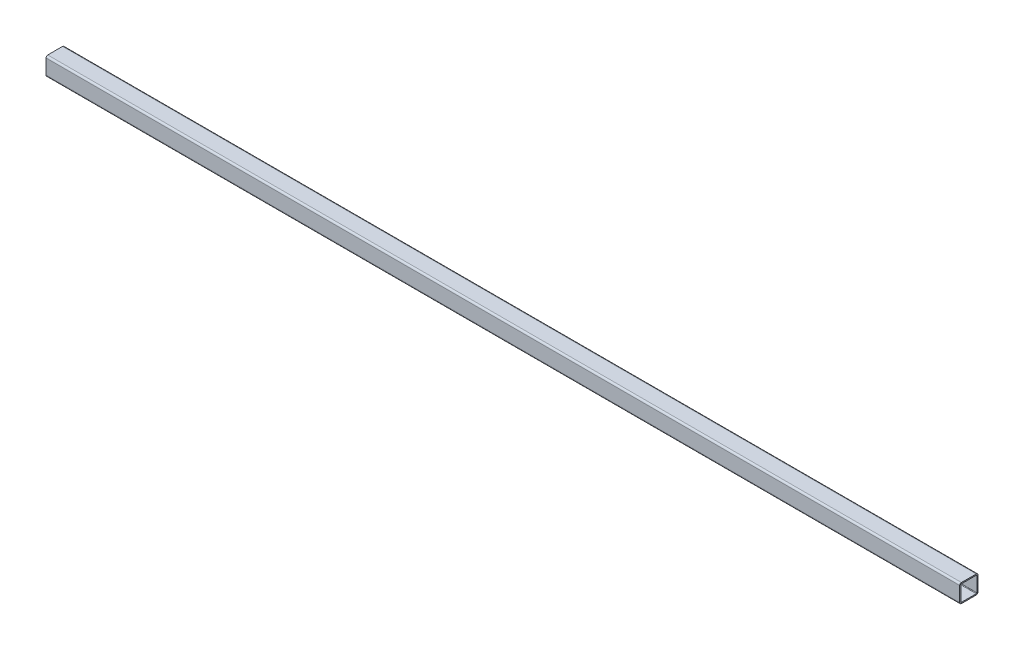
ISO-10303-21;
HEADER;
FILE_DESCRIPTION(('STEP AP214'),'2;1');
FILE_NAME('part.step','',(''),(''),'','','');
FILE_SCHEMA(('AUTOMOTIVE_DESIGN { 1 0 10303 214 1 1 1 1 }'));
ENDSEC;
DATA;
#1=APPLICATION_CONTEXT('core data for automotive mechanical design processes');
#2=APPLICATION_PROTOCOL_DEFINITION('international standard','automotive_design',2000,#1);
#3=PRODUCT_CONTEXT('',#1,'mechanical');
#4=PRODUCT('Part','Part','',(#3));
#5=PRODUCT_RELATED_PRODUCT_CATEGORY('part','',(#4));
#6=PRODUCT_DEFINITION_FORMATION('','',#4);
#7=PRODUCT_DEFINITION_CONTEXT('part definition',#1,'design');
#8=PRODUCT_DEFINITION('design','',#6,#7);
#9=PRODUCT_DEFINITION_SHAPE('','',#8);
#10=(LENGTH_UNIT() NAMED_UNIT(*) SI_UNIT(.MILLI.,.METRE.));
#11=(NAMED_UNIT(*) PLANE_ANGLE_UNIT() SI_UNIT($,.RADIAN.));
#12=(NAMED_UNIT(*) SI_UNIT($,.STERADIAN.) SOLID_ANGLE_UNIT());
#13=UNCERTAINTY_MEASURE_WITH_UNIT(LENGTH_MEASURE(1.E-05),#10,'distance_accuracy_value','');
#14=(GEOMETRIC_REPRESENTATION_CONTEXT(3) GLOBAL_UNCERTAINTY_ASSIGNED_CONTEXT((#13)) GLOBAL_UNIT_ASSIGNED_CONTEXT((#10,
#11,#12)) REPRESENTATION_CONTEXT('',''));
#15=CARTESIAN_POINT('',(0.,0.,0.));
#16=DIRECTION('',(0.,0.,1.));
#17=DIRECTION('',(1.,0.,0.));
#18=AXIS2_PLACEMENT_3D('',#15,#16,#17);
#19=CARTESIAN_POINT('',(1000.,16.25,16.25));
#20=DIRECTION('',(-1.,0.,0.));
#21=DIRECTION('',(0.,0.,1.));
#22=AXIS2_PLACEMENT_3D('',#19,#20,#21);
#23=CYLINDRICAL_SURFACE('',#22,3.75);
#24=CARTESIAN_POINT('',(-1000.,16.25,16.25));
#25=DIRECTION('',(1.,0.,0.));
#26=DIRECTION('',(0.,0.,-1.));
#27=AXIS2_PLACEMENT_3D('',#24,#25,#26);
#28=CIRCLE('',#27,3.75);
#29=CARTESIAN_POINT('',(-1000.,20.,16.25));
#30=VERTEX_POINT('',#29);
#31=CARTESIAN_POINT('',(-1000.,16.25,20.));
#32=VERTEX_POINT('',#31);
#33=EDGE_CURVE('E246',#30,#32,#28,.T.);
#34=ORIENTED_EDGE('',*,*,#33,.T.);
#35=DIRECTION('',(-1.,0.,0.));
#36=VECTOR('',#35,1.);
#37=CARTESIAN_POINT('',(1000.,16.25,20.));
#38=LINE('',#37,#36);
#39=CARTESIAN_POINT('',(1000.,16.25,20.));
#40=VERTEX_POINT('',#39);
#41=EDGE_CURVE('E14',#40,#32,#38,.T.);
#42=ORIENTED_EDGE('',*,*,#41,.F.);
#43=CARTESIAN_POINT('',(1000.,16.25,16.25));
#44=DIRECTION('',(1.,0.,0.));
#45=DIRECTION('',(0.,0.,-1.));
#46=AXIS2_PLACEMENT_3D('',#43,#44,#45);
#47=CIRCLE('',#46,3.75);
#48=CARTESIAN_POINT('',(1000.,20.,16.25));
#49=VERTEX_POINT('',#48);
#50=EDGE_CURVE('E324',#49,#40,#47,.T.);
#51=ORIENTED_EDGE('',*,*,#50,.F.);
#52=DIRECTION('',(-1.,0.,0.));
#53=VECTOR('',#52,1.);
#54=CARTESIAN_POINT('',(1000.,20.,16.25));
#55=LINE('',#54,#53);
#56=EDGE_CURVE('E261',#49,#30,#55,.T.);
#57=ORIENTED_EDGE('',*,*,#56,.T.);
#58=EDGE_LOOP('',(#34,#42,#51,#57));
#59=FACE_BOUND('',#58,.T.);
#60=ADVANCED_FACE('F74',(#59),#23,.T.);
#61=CARTESIAN_POINT('',(1000.,16.25,20.));
#62=DIRECTION('',(0.,0.,-1.));
#63=DIRECTION('',(-1.,0.,0.));
#64=AXIS2_PLACEMENT_3D('',#61,#62,#63);
#65=PLANE('',#64);
#66=DIRECTION('',(0.,-1.,0.));
#67=VECTOR('',#66,1.);
#68=CARTESIAN_POINT('',(-1000.,16.25,20.));
#69=LINE('',#68,#67);
#70=CARTESIAN_POINT('',(-1000.,-16.25,20.));
#71=VERTEX_POINT('',#70);
#72=EDGE_CURVE('E249',#32,#71,#69,.T.);
#73=ORIENTED_EDGE('',*,*,#72,.T.);
#74=DIRECTION('',(-1.,0.,0.));
#75=VECTOR('',#74,1.);
#76=CARTESIAN_POINT('',(1000.,-16.25,20.));
#77=LINE('',#76,#75);
#78=CARTESIAN_POINT('',(1000.,-16.25,20.));
#79=VERTEX_POINT('',#78);
#80=EDGE_CURVE('E84',#79,#71,#77,.T.);
#81=ORIENTED_EDGE('',*,*,#80,.F.);
#82=DIRECTION('',(0.,-1.,0.));
#83=VECTOR('',#82,1.);
#84=CARTESIAN_POINT('',(1000.,16.25,20.));
#85=LINE('',#84,#83);
#86=EDGE_CURVE('E326',#40,#79,#85,.T.);
#87=ORIENTED_EDGE('',*,*,#86,.F.);
#88=ORIENTED_EDGE('',*,*,#41,.T.);
#89=EDGE_LOOP('',(#73,#81,#87,#88));
#90=FACE_BOUND('',#89,.T.);
#91=ADVANCED_FACE('F361',(#90),#65,.F.);
#92=CARTESIAN_POINT('',(1000.,-16.25,16.25));
#93=DIRECTION('',(-1.,0.,0.));
#94=DIRECTION('',(0.,0.,1.));
#95=AXIS2_PLACEMENT_3D('',#92,#93,#94);
#96=CYLINDRICAL_SURFACE('',#95,3.75);
#97=CARTESIAN_POINT('',(-1000.,-16.25,16.25));
#98=DIRECTION('',(1.,0.,0.));
#99=DIRECTION('',(0.,0.,-1.));
#100=AXIS2_PLACEMENT_3D('',#97,#98,#99);
#101=CIRCLE('',#100,3.75);
#102=CARTESIAN_POINT('',(-1000.,-20.,16.25));
#103=VERTEX_POINT('',#102);
#104=EDGE_CURVE('E251',#71,#103,#101,.T.);
#105=ORIENTED_EDGE('',*,*,#104,.T.);
#106=DIRECTION('',(-1.,0.,0.));
#107=VECTOR('',#106,1.);
#108=CARTESIAN_POINT('',(1000.,-20.,16.25));
#109=LINE('',#108,#107);
#110=CARTESIAN_POINT('',(1000.,-20.,16.25));
#111=VERTEX_POINT('',#110);
#112=EDGE_CURVE('E268',#111,#103,#109,.T.);
#113=ORIENTED_EDGE('',*,*,#112,.F.);
#114=CARTESIAN_POINT('',(1000.,-16.25,16.25));
#115=DIRECTION('',(1.,0.,0.));
#116=DIRECTION('',(0.,0.,-1.));
#117=AXIS2_PLACEMENT_3D('',#114,#115,#116);
#118=CIRCLE('',#117,3.75);
#119=EDGE_CURVE('E328',#79,#111,#118,.T.);
#120=ORIENTED_EDGE('',*,*,#119,.F.);
#121=ORIENTED_EDGE('',*,*,#80,.T.);
#122=EDGE_LOOP('',(#105,#113,#120,#121));
#123=FACE_BOUND('',#122,.T.);
#124=ADVANCED_FACE('F366',(#123),#96,.T.);
#125=CARTESIAN_POINT('',(1000.,-20.,-16.25));
#126=DIRECTION('',(0.,1.,0.));
#127=DIRECTION('',(0.,0.,1.));
#128=AXIS2_PLACEMENT_3D('',#125,#126,#127);
#129=PLANE('',#128);
#130=DIRECTION('',(0.,0.,-1.));
#131=VECTOR('',#130,1.);
#132=CARTESIAN_POINT('',(-1000.,-20.,-16.25));
#133=LINE('',#132,#131);
#134=CARTESIAN_POINT('',(-1000.,-20.,-16.25));
#135=VERTEX_POINT('',#134);
#136=EDGE_CURVE('E253',#103,#135,#133,.T.);
#137=ORIENTED_EDGE('',*,*,#136,.T.);
#138=DIRECTION('',(-1.,0.,0.));
#139=VECTOR('',#138,1.);
#140=CARTESIAN_POINT('',(1000.,-20.,-16.25));
#141=LINE('',#140,#139);
#142=CARTESIAN_POINT('',(1000.,-20.,-16.25));
#143=VERTEX_POINT('',#142);
#144=EDGE_CURVE('E265',#143,#135,#141,.T.);
#145=ORIENTED_EDGE('',*,*,#144,.F.);
#146=DIRECTION('',(0.,0.,-1.));
#147=VECTOR('',#146,1.);
#148=CARTESIAN_POINT('',(1000.,-20.,-16.25));
#149=LINE('',#148,#147);
#150=EDGE_CURVE('E330',#111,#143,#149,.T.);
#151=ORIENTED_EDGE('',*,*,#150,.F.);
#152=ORIENTED_EDGE('',*,*,#112,.T.);
#153=EDGE_LOOP('',(#137,#145,#151,#152));
#154=FACE_BOUND('',#153,.T.);
#155=ADVANCED_FACE('F336',(#154),#129,.F.);
#156=CARTESIAN_POINT('',(1000.,-16.25,-16.25));
#157=DIRECTION('',(-1.,0.,0.));
#158=DIRECTION('',(0.,0.,1.));
#159=AXIS2_PLACEMENT_3D('',#156,#157,#158);
#160=CYLINDRICAL_SURFACE('',#159,3.75);
#161=CARTESIAN_POINT('',(-1000.,-16.25,-16.25));
#162=DIRECTION('',(1.,0.,0.));
#163=DIRECTION('',(0.,0.,-1.));
#164=AXIS2_PLACEMENT_3D('',#161,#162,#163);
#165=CIRCLE('',#164,3.75);
#166=CARTESIAN_POINT('',(-1000.,-16.25,-20.));
#167=VERTEX_POINT('',#166);
#168=EDGE_CURVE('E255',#135,#167,#165,.T.);
#169=ORIENTED_EDGE('',*,*,#168,.T.);
#170=DIRECTION('',(-1.,0.,0.));
#171=VECTOR('',#170,1.);
#172=CARTESIAN_POINT('',(1000.,-16.25,-20.));
#173=LINE('',#172,#171);
#174=CARTESIAN_POINT('',(1000.,-16.25,-20.));
#175=VERTEX_POINT('',#174);
#176=EDGE_CURVE('E213',#175,#167,#173,.T.);
#177=ORIENTED_EDGE('',*,*,#176,.F.);
#178=CARTESIAN_POINT('',(1000.,-16.25,-16.25));
#179=DIRECTION('',(1.,0.,0.));
#180=DIRECTION('',(0.,0.,-1.));
#181=AXIS2_PLACEMENT_3D('',#178,#179,#180);
#182=CIRCLE('',#181,3.75);
#183=EDGE_CURVE('E204',#143,#175,#182,.T.);
#184=ORIENTED_EDGE('',*,*,#183,.F.);
#185=ORIENTED_EDGE('',*,*,#144,.T.);
#186=EDGE_LOOP('',(#169,#177,#184,#185));
#187=FACE_BOUND('',#186,.T.);
#188=ADVANCED_FACE('F340',(#187),#160,.T.);
#189=CARTESIAN_POINT('',(1000.,-16.25,-20.));
#190=DIRECTION('',(0.,0.,1.));
#191=DIRECTION('',(1.,0.,0.));
#192=AXIS2_PLACEMENT_3D('',#189,#190,#191);
#193=PLANE('',#192);
#194=DIRECTION('',(0.,1.,0.));
#195=VECTOR('',#194,1.);
#196=CARTESIAN_POINT('',(-1000.,-16.25,-20.));
#197=LINE('',#196,#195);
#198=CARTESIAN_POINT('',(-1000.,16.25,-20.));
#199=VERTEX_POINT('',#198);
#200=EDGE_CURVE('E212',#167,#199,#197,.T.);
#201=ORIENTED_EDGE('',*,*,#200,.T.);
#202=DIRECTION('',(-1.,0.,0.));
#203=VECTOR('',#202,1.);
#204=CARTESIAN_POINT('',(1000.,16.25,-20.));
#205=LINE('',#204,#203);
#206=CARTESIAN_POINT('',(1000.,16.25,-20.));
#207=VERTEX_POINT('',#206);
#208=EDGE_CURVE('E209',#207,#199,#205,.T.);
#209=ORIENTED_EDGE('',*,*,#208,.F.);
#210=DIRECTION('',(0.,1.,0.));
#211=VECTOR('',#210,1.);
#212=CARTESIAN_POINT('',(1000.,-16.25,-20.));
#213=LINE('',#212,#211);
#214=EDGE_CURVE('E198',#175,#207,#213,.T.);
#215=ORIENTED_EDGE('',*,*,#214,.F.);
#216=ORIENTED_EDGE('',*,*,#176,.T.);
#217=EDGE_LOOP('',(#201,#209,#215,#216));
#218=FACE_BOUND('',#217,.T.);
#219=ADVANCED_FACE('F210',(#218),#193,.F.);
#220=CARTESIAN_POINT('',(1000.,16.25,-16.25));
#221=DIRECTION('',(-1.,0.,0.));
#222=DIRECTION('',(0.,0.,1.));
#223=AXIS2_PLACEMENT_3D('',#220,#221,#222);
#224=CYLINDRICAL_SURFACE('',#223,3.75);
#225=CARTESIAN_POINT('',(-1000.,16.25,-16.25));
#226=DIRECTION('',(1.,0.,0.));
#227=DIRECTION('',(0.,0.,-1.));
#228=AXIS2_PLACEMENT_3D('',#225,#226,#227);
#229=CIRCLE('',#228,3.75);
#230=CARTESIAN_POINT('',(-1000.,20.,-16.25));
#231=VERTEX_POINT('',#230);
#232=EDGE_CURVE('E146',#199,#231,#229,.T.);
#233=ORIENTED_EDGE('',*,*,#232,.T.);
#234=DIRECTION('',(-1.,0.,0.));
#235=VECTOR('',#234,1.);
#236=CARTESIAN_POINT('',(1000.,20.,-16.25));
#237=LINE('',#236,#235);
#238=CARTESIAN_POINT('',(1000.,20.,-16.25));
#239=VERTEX_POINT('',#238);
#240=EDGE_CURVE('E214',#239,#231,#237,.T.);
#241=ORIENTED_EDGE('',*,*,#240,.F.);
#242=CARTESIAN_POINT('',(1000.,16.25,-16.25));
#243=DIRECTION('',(1.,0.,0.));
#244=DIRECTION('',(0.,0.,-1.));
#245=AXIS2_PLACEMENT_3D('',#242,#243,#244);
#246=CIRCLE('',#245,3.75);
#247=EDGE_CURVE('E202',#207,#239,#246,.T.);
#248=ORIENTED_EDGE('',*,*,#247,.F.);
#249=ORIENTED_EDGE('',*,*,#208,.T.);
#250=EDGE_LOOP('',(#233,#241,#248,#249));
#251=FACE_BOUND('',#250,.T.);
#252=ADVANCED_FACE('F216',(#251),#224,.T.);
#253=CARTESIAN_POINT('',(1000.,-16.25,16.25));
#254=DIRECTION('',(-1.,0.,0.));
#255=DIRECTION('',(0.,0.,1.));
#256=AXIS2_PLACEMENT_3D('',#253,#254,#255);
#257=CYLINDRICAL_SURFACE('',#256,1.25);
#258=CARTESIAN_POINT('',(-1000.,-16.25,16.25));
#259=DIRECTION('',(1.,0.,0.));
#260=DIRECTION('',(0.,0.,-1.));
#261=AXIS2_PLACEMENT_3D('',#258,#259,#260);
#262=CIRCLE('',#261,1.25);
#263=CARTESIAN_POINT('',(-1000.,-16.25,17.5));
#264=VERTEX_POINT('',#263);
#265=CARTESIAN_POINT('',(-1000.,-17.5,16.25));
#266=VERTEX_POINT('',#265);
#267=EDGE_CURVE('E222',#264,#266,#262,.T.);
#268=ORIENTED_EDGE('',*,*,#267,.F.);
#269=DIRECTION('',(-1.,0.,0.));
#270=VECTOR('',#269,1.);
#271=CARTESIAN_POINT('',(1000.,-16.25,17.5));
#272=LINE('',#271,#270);
#273=CARTESIAN_POINT('',(1000.,-16.25,17.5));
#274=VERTEX_POINT('',#273);
#275=EDGE_CURVE('E78',#274,#264,#272,.T.);
#276=ORIENTED_EDGE('',*,*,#275,.F.);
#277=CARTESIAN_POINT('',(1000.,-16.25,16.25));
#278=DIRECTION('',(1.,0.,0.));
#279=DIRECTION('',(0.,0.,-1.));
#280=AXIS2_PLACEMENT_3D('',#277,#278,#279);
#281=CIRCLE('',#280,1.25);
#282=CARTESIAN_POINT('',(1000.,-17.5,16.25));
#283=VERTEX_POINT('',#282);
#284=EDGE_CURVE('E260',#274,#283,#281,.T.);
#285=ORIENTED_EDGE('',*,*,#284,.T.);
#286=DIRECTION('',(-1.,0.,0.));
#287=VECTOR('',#286,1.);
#288=CARTESIAN_POINT('',(1000.,-17.5,16.25));
#289=LINE('',#288,#287);
#290=EDGE_CURVE('E218',#283,#266,#289,.T.);
#291=ORIENTED_EDGE('',*,*,#290,.T.);
#292=EDGE_LOOP('',(#268,#276,#285,#291));
#293=FACE_BOUND('',#292,.T.);
#294=ADVANCED_FACE('F76',(#293),#257,.F.);
#295=CARTESIAN_POINT('',(1000.,16.25,17.5));
#296=DIRECTION('',(0.,0.,-1.));
#297=DIRECTION('',(-1.,0.,0.));
#298=AXIS2_PLACEMENT_3D('',#295,#296,#297);
#299=PLANE('',#298);
#300=DIRECTION('',(0.,-1.,0.));
#301=VECTOR('',#300,1.);
#302=CARTESIAN_POINT('',(-1000.,16.25,17.5));
#303=LINE('',#302,#301);
#304=CARTESIAN_POINT('',(-1000.,16.25,17.5));
#305=VERTEX_POINT('',#304);
#306=EDGE_CURVE('E225',#305,#264,#303,.T.);
#307=ORIENTED_EDGE('',*,*,#306,.F.);
#308=DIRECTION('',(-1.,0.,0.));
#309=VECTOR('',#308,1.);
#310=CARTESIAN_POINT('',(1000.,16.25,17.5));
#311=LINE('',#310,#309);
#312=CARTESIAN_POINT('',(1000.,16.25,17.5));
#313=VERTEX_POINT('',#312);
#314=EDGE_CURVE('E283',#313,#305,#311,.T.);
#315=ORIENTED_EDGE('',*,*,#314,.F.);
#316=DIRECTION('',(0.,-1.,0.));
#317=VECTOR('',#316,1.);
#318=CARTESIAN_POINT('',(1000.,16.25,17.5));
#319=LINE('',#318,#317);
#320=EDGE_CURVE('E292',#313,#274,#319,.T.);
#321=ORIENTED_EDGE('',*,*,#320,.T.);
#322=ORIENTED_EDGE('',*,*,#275,.T.);
#323=EDGE_LOOP('',(#307,#315,#321,#322));
#324=FACE_BOUND('',#323,.T.);
#325=ADVANCED_FACE('F290',(#324),#299,.T.);
#326=CARTESIAN_POINT('',(1000.,16.25,16.25));
#327=DIRECTION('',(-1.,0.,0.));
#328=DIRECTION('',(0.,0.,1.));
#329=AXIS2_PLACEMENT_3D('',#326,#327,#328);
#330=CYLINDRICAL_SURFACE('',#329,1.25);
#331=CARTESIAN_POINT('',(-1000.,16.25,16.25));
#332=DIRECTION('',(1.,0.,0.));
#333=DIRECTION('',(0.,0.,-1.));
#334=AXIS2_PLACEMENT_3D('',#331,#332,#333);
#335=CIRCLE('',#334,1.25);
#336=CARTESIAN_POINT('',(-1000.,17.5,16.25));
#337=VERTEX_POINT('',#336);
#338=EDGE_CURVE('E228',#337,#305,#335,.T.);
#339=ORIENTED_EDGE('',*,*,#338,.F.);
#340=DIRECTION('',(-1.,0.,0.));
#341=VECTOR('',#340,1.);
#342=CARTESIAN_POINT('',(1000.,17.5,16.25));
#343=LINE('',#342,#341);
#344=CARTESIAN_POINT('',(1000.,17.5,16.25));
#345=VERTEX_POINT('',#344);
#346=EDGE_CURVE('E282',#345,#337,#343,.T.);
#347=ORIENTED_EDGE('',*,*,#346,.F.);
#348=CARTESIAN_POINT('',(1000.,16.25,16.25));
#349=DIRECTION('',(1.,0.,0.));
#350=DIRECTION('',(0.,0.,-1.));
#351=AXIS2_PLACEMENT_3D('',#348,#349,#350);
#352=CIRCLE('',#351,1.25);
#353=EDGE_CURVE('E300',#345,#313,#352,.T.);
#354=ORIENTED_EDGE('',*,*,#353,.T.);
#355=ORIENTED_EDGE('',*,*,#314,.T.);
#356=EDGE_LOOP('',(#339,#347,#354,#355));
#357=FACE_BOUND('',#356,.T.);
#358=ADVANCED_FACE('F298',(#357),#330,.F.);
#359=CARTESIAN_POINT('',(1000.,17.5,16.25));
#360=DIRECTION('',(0.,-1.,0.));
#361=DIRECTION('',(0.,0.,-1.));
#362=AXIS2_PLACEMENT_3D('',#359,#360,#361);
#363=PLANE('',#362);
#364=DIRECTION('',(0.,0.,1.));
#365=VECTOR('',#364,1.);
#366=CARTESIAN_POINT('',(-1000.,17.5,16.25));
#367=LINE('',#366,#365);
#368=CARTESIAN_POINT('',(-1000.,17.5,-16.25));
#369=VERTEX_POINT('',#368);
#370=EDGE_CURVE('E231',#369,#337,#367,.T.);
#371=ORIENTED_EDGE('',*,*,#370,.F.);
#372=DIRECTION('',(-1.,0.,0.));
#373=VECTOR('',#372,1.);
#374=CARTESIAN_POINT('',(1000.,17.5,-16.25));
#375=LINE('',#374,#373);
#376=CARTESIAN_POINT('',(1000.,17.5,-16.25));
#377=VERTEX_POINT('',#376);
#378=EDGE_CURVE('E280',#377,#369,#375,.T.);
#379=ORIENTED_EDGE('',*,*,#378,.F.);
#380=DIRECTION('',(0.,0.,1.));
#381=VECTOR('',#380,1.);
#382=CARTESIAN_POINT('',(1000.,17.5,16.25));
#383=LINE('',#382,#381);
#384=EDGE_CURVE('E306',#377,#345,#383,.T.);
#385=ORIENTED_EDGE('',*,*,#384,.T.);
#386=ORIENTED_EDGE('',*,*,#346,.T.);
#387=EDGE_LOOP('',(#371,#379,#385,#386));
#388=FACE_BOUND('',#387,.T.);
#389=ADVANCED_FACE('F309',(#388),#363,.T.);
#390=CARTESIAN_POINT('',(1000.,16.25,-16.25));
#391=DIRECTION('',(-1.,0.,0.));
#392=DIRECTION('',(0.,0.,1.));
#393=AXIS2_PLACEMENT_3D('',#390,#391,#392);
#394=CYLINDRICAL_SURFACE('',#393,1.25);
#395=CARTESIAN_POINT('',(-1000.,16.25,-16.25));
#396=DIRECTION('',(1.,0.,0.));
#397=DIRECTION('',(0.,0.,-1.));
#398=AXIS2_PLACEMENT_3D('',#395,#396,#397);
#399=CIRCLE('',#398,1.25);
#400=CARTESIAN_POINT('',(-1000.,16.25,-17.5));
#401=VERTEX_POINT('',#400);
#402=EDGE_CURVE('E234',#401,#369,#399,.T.);
#403=ORIENTED_EDGE('',*,*,#402,.F.);
#404=DIRECTION('',(-1.,0.,0.));
#405=VECTOR('',#404,1.);
#406=CARTESIAN_POINT('',(1000.,16.25,-17.5));
#407=LINE('',#406,#405);
#408=CARTESIAN_POINT('',(1000.,16.25,-17.5));
#409=VERTEX_POINT('',#408);
#410=EDGE_CURVE('E278',#409,#401,#407,.T.);
#411=ORIENTED_EDGE('',*,*,#410,.F.);
#412=CARTESIAN_POINT('',(1000.,16.25,-16.25));
#413=DIRECTION('',(1.,0.,0.));
#414=DIRECTION('',(0.,0.,-1.));
#415=AXIS2_PLACEMENT_3D('',#412,#413,#414);
#416=CIRCLE('',#415,1.25);
#417=EDGE_CURVE('E310',#409,#377,#416,.T.);
#418=ORIENTED_EDGE('',*,*,#417,.T.);
#419=ORIENTED_EDGE('',*,*,#378,.T.);
#420=EDGE_LOOP('',(#403,#411,#418,#419));
#421=FACE_BOUND('',#420,.T.);
#422=ADVANCED_FACE('F377',(#421),#394,.F.);
#423=CARTESIAN_POINT('',(1000.,-16.25,-17.5));
#424=DIRECTION('',(0.,0.,1.));
#425=DIRECTION('',(1.,0.,0.));
#426=AXIS2_PLACEMENT_3D('',#423,#424,#425);
#427=PLANE('',#426);
#428=DIRECTION('',(0.,1.,0.));
#429=VECTOR('',#428,1.);
#430=CARTESIAN_POINT('',(-1000.,-16.25,-17.5));
#431=LINE('',#430,#429);
#432=CARTESIAN_POINT('',(-1000.,-16.25,-17.5));
#433=VERTEX_POINT('',#432);
#434=EDGE_CURVE('E237',#433,#401,#431,.T.);
#435=ORIENTED_EDGE('',*,*,#434,.F.);
#436=DIRECTION('',(-1.,0.,0.));
#437=VECTOR('',#436,1.);
#438=CARTESIAN_POINT('',(1000.,-16.25,-17.5));
#439=LINE('',#438,#437);
#440=CARTESIAN_POINT('',(1000.,-16.25,-17.5));
#441=VERTEX_POINT('',#440);
#442=EDGE_CURVE('E276',#441,#433,#439,.T.);
#443=ORIENTED_EDGE('',*,*,#442,.F.);
#444=DIRECTION('',(0.,1.,0.));
#445=VECTOR('',#444,1.);
#446=CARTESIAN_POINT('',(1000.,-16.25,-17.5));
#447=LINE('',#446,#445);
#448=EDGE_CURVE('E312',#441,#409,#447,.T.);
#449=ORIENTED_EDGE('',*,*,#448,.T.);
#450=ORIENTED_EDGE('',*,*,#410,.T.);
#451=EDGE_LOOP('',(#435,#443,#449,#450));
#452=FACE_BOUND('',#451,.T.);
#453=ADVANCED_FACE('F373',(#452),#427,.T.);
#454=CARTESIAN_POINT('',(1000.,-16.25,-16.25));
#455=DIRECTION('',(-1.,0.,0.));
#456=DIRECTION('',(0.,0.,1.));
#457=AXIS2_PLACEMENT_3D('',#454,#455,#456);
#458=CYLINDRICAL_SURFACE('',#457,1.25);
#459=CARTESIAN_POINT('',(-1000.,-16.25,-16.25));
#460=DIRECTION('',(1.,0.,0.));
#461=DIRECTION('',(0.,0.,-1.));
#462=AXIS2_PLACEMENT_3D('',#459,#460,#461);
#463=CIRCLE('',#462,1.25);
#464=CARTESIAN_POINT('',(-1000.,-17.5,-16.25));
#465=VERTEX_POINT('',#464);
#466=EDGE_CURVE('E240',#465,#433,#463,.T.);
#467=ORIENTED_EDGE('',*,*,#466,.F.);
#468=DIRECTION('',(-1.,0.,0.));
#469=VECTOR('',#468,1.);
#470=CARTESIAN_POINT('',(1000.,-17.5,-16.25));
#471=LINE('',#470,#469);
#472=CARTESIAN_POINT('',(1000.,-17.5,-16.25));
#473=VERTEX_POINT('',#472);
#474=EDGE_CURVE('E274',#473,#465,#471,.T.);
#475=ORIENTED_EDGE('',*,*,#474,.F.);
#476=CARTESIAN_POINT('',(1000.,-16.25,-16.25));
#477=DIRECTION('',(1.,0.,0.));
#478=DIRECTION('',(0.,0.,-1.));
#479=AXIS2_PLACEMENT_3D('',#476,#477,#478);
#480=CIRCLE('',#479,1.25);
#481=EDGE_CURVE('E318',#473,#441,#480,.T.);
#482=ORIENTED_EDGE('',*,*,#481,.T.);
#483=ORIENTED_EDGE('',*,*,#442,.T.);
#484=EDGE_LOOP('',(#467,#475,#482,#483));
#485=FACE_BOUND('',#484,.T.);
#486=ADVANCED_FACE('F355',(#485),#458,.F.);
#487=CARTESIAN_POINT('',(1000.,-17.5,-16.25));
#488=DIRECTION('',(0.,1.,0.));
#489=DIRECTION('',(0.,0.,1.));
#490=AXIS2_PLACEMENT_3D('',#487,#488,#489);
#491=PLANE('',#490);
#492=DIRECTION('',(0.,0.,-1.));
#493=VECTOR('',#492,1.);
#494=CARTESIAN_POINT('',(-1000.,-17.5,-16.25));
#495=LINE('',#494,#493);
#496=EDGE_CURVE('E243',#266,#465,#495,.T.);
#497=ORIENTED_EDGE('',*,*,#496,.F.);
#498=ORIENTED_EDGE('',*,*,#290,.F.);
#499=DIRECTION('',(0.,0.,-1.));
#500=VECTOR('',#499,1.);
#501=CARTESIAN_POINT('',(1000.,-17.5,-16.25));
#502=LINE('',#501,#500);
#503=EDGE_CURVE('E321',#283,#473,#502,.T.);
#504=ORIENTED_EDGE('',*,*,#503,.T.);
#505=ORIENTED_EDGE('',*,*,#474,.T.);
#506=EDGE_LOOP('',(#497,#498,#504,#505));
#507=FACE_BOUND('',#506,.T.);
#508=ADVANCED_FACE('F348',(#507),#491,.T.);
#509=CARTESIAN_POINT('',(1000.,20.,16.25));
#510=DIRECTION('',(0.,-1.,0.));
#511=DIRECTION('',(0.,0.,-1.));
#512=AXIS2_PLACEMENT_3D('',#509,#510,#511);
#513=PLANE('',#512);
#514=DIRECTION('',(0.,0.,1.));
#515=VECTOR('',#514,1.);
#516=CARTESIAN_POINT('',(-1000.,20.,16.25));
#517=LINE('',#516,#515);
#518=EDGE_CURVE('E152',#231,#30,#517,.T.);
#519=ORIENTED_EDGE('',*,*,#518,.T.);
#520=ORIENTED_EDGE('',*,*,#56,.F.);
#521=DIRECTION('',(0.,0.,1.));
#522=VECTOR('',#521,1.);
#523=CARTESIAN_POINT('',(1000.,20.,16.25));
#524=LINE('',#523,#522);
#525=EDGE_CURVE('E93',#239,#49,#524,.T.);
#526=ORIENTED_EDGE('',*,*,#525,.F.);
#527=ORIENTED_EDGE('',*,*,#240,.T.);
#528=EDGE_LOOP('',(#519,#520,#526,#527));
#529=FACE_BOUND('',#528,.T.);
#530=ADVANCED_FACE('F346',(#529),#513,.F.);
#531=CARTESIAN_POINT('',(1000.,16.25,16.25));
#532=DIRECTION('',(1.,0.,0.));
#533=DIRECTION('',(0.,0.,-1.));
#534=AXIS2_PLACEMENT_3D('',#531,#532,#533);
#535=PLANE('',#534);
#536=ORIENTED_EDGE('',*,*,#284,.F.);
#537=ORIENTED_EDGE('',*,*,#320,.F.);
#538=ORIENTED_EDGE('',*,*,#353,.F.);
#539=ORIENTED_EDGE('',*,*,#384,.F.);
#540=ORIENTED_EDGE('',*,*,#417,.F.);
#541=ORIENTED_EDGE('',*,*,#448,.F.);
#542=ORIENTED_EDGE('',*,*,#481,.F.);
#543=ORIENTED_EDGE('',*,*,#503,.F.);
#544=EDGE_LOOP('',(#536,#537,#538,#539,#540,#541,#542,#543));
#545=FACE_BOUND('',#544,.T.);
#546=ORIENTED_EDGE('',*,*,#50,.T.);
#547=ORIENTED_EDGE('',*,*,#86,.T.);
#548=ORIENTED_EDGE('',*,*,#119,.T.);
#549=ORIENTED_EDGE('',*,*,#150,.T.);
#550=ORIENTED_EDGE('',*,*,#183,.T.);
#551=ORIENTED_EDGE('',*,*,#214,.T.);
#552=ORIENTED_EDGE('',*,*,#247,.T.);
#553=ORIENTED_EDGE('',*,*,#525,.T.);
#554=EDGE_LOOP('',(#546,#547,#548,#549,#550,#551,#552,#553));
#555=FACE_BOUND('',#554,.T.);
#556=ADVANCED_FACE('F200',(#545,#555),#535,.T.);
#557=CARTESIAN_POINT('',(-1000.,16.25,16.25));
#558=DIRECTION('',(1.,0.,0.));
#559=DIRECTION('',(0.,0.,-1.));
#560=AXIS2_PLACEMENT_3D('',#557,#558,#559);
#561=PLANE('',#560);
#562=ORIENTED_EDGE('',*,*,#267,.T.);
#563=ORIENTED_EDGE('',*,*,#496,.T.);
#564=ORIENTED_EDGE('',*,*,#466,.T.);
#565=ORIENTED_EDGE('',*,*,#434,.T.);
#566=ORIENTED_EDGE('',*,*,#402,.T.);
#567=ORIENTED_EDGE('',*,*,#370,.T.);
#568=ORIENTED_EDGE('',*,*,#338,.T.);
#569=ORIENTED_EDGE('',*,*,#306,.T.);
#570=EDGE_LOOP('',(#562,#563,#564,#565,#566,#567,#568,#569));
#571=FACE_BOUND('',#570,.T.);
#572=ORIENTED_EDGE('',*,*,#33,.F.);
#573=ORIENTED_EDGE('',*,*,#518,.F.);
#574=ORIENTED_EDGE('',*,*,#232,.F.);
#575=ORIENTED_EDGE('',*,*,#200,.F.);
#576=ORIENTED_EDGE('',*,*,#168,.F.);
#577=ORIENTED_EDGE('',*,*,#136,.F.);
#578=ORIENTED_EDGE('',*,*,#104,.F.);
#579=ORIENTED_EDGE('',*,*,#72,.F.);
#580=EDGE_LOOP('',(#572,#573,#574,#575,#576,#577,#578,#579));
#581=FACE_BOUND('',#580,.T.);
#582=ADVANCED_FACE('F295',(#571,#581),#561,.F.);
#583=CLOSED_SHELL('',(#60,#91,#124,#155,#188,#219,#252,#294,#325,#358,#389,#422,#453,#486,#508,
#530,#556,#582));
#584=MANIFOLD_SOLID_BREP('B2',#583);
#585=ADVANCED_BREP_SHAPE_REPRESENTATION('',(#18,#584),#14);
#586=SHAPE_DEFINITION_REPRESENTATION(#9,#585);
ENDSEC;
END-ISO-10303-21;
